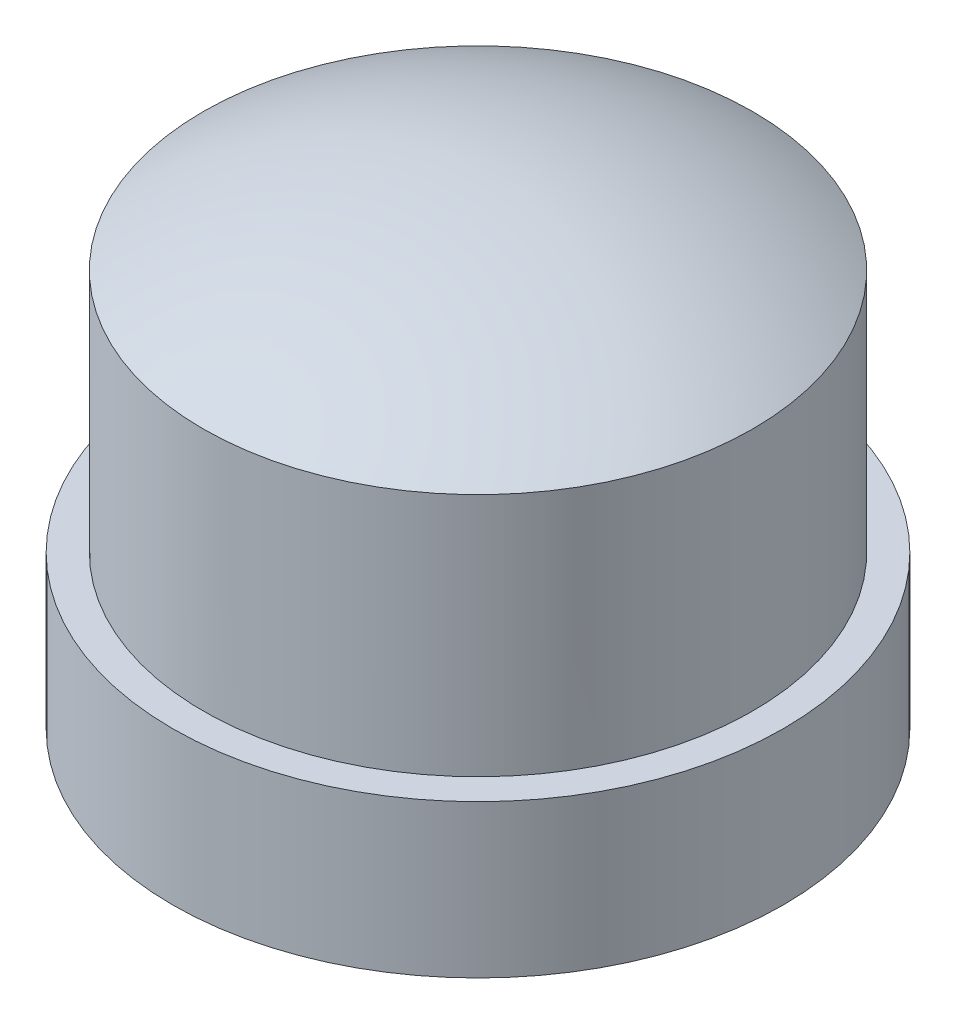
ISO-10303-21;
HEADER;
FILE_DESCRIPTION(('STEP AP214'),'2;1');
FILE_NAME('part.step','',(''),(''),'','','');
FILE_SCHEMA(('AUTOMOTIVE_DESIGN { 1 0 10303 214 1 1 1 1 }'));
ENDSEC;
DATA;
#1=APPLICATION_CONTEXT('core data for automotive mechanical design processes');
#2=APPLICATION_PROTOCOL_DEFINITION('international standard','automotive_design',2000,#1);
#3=PRODUCT_CONTEXT('',#1,'mechanical');
#4=PRODUCT('Part','Part','',(#3));
#5=PRODUCT_RELATED_PRODUCT_CATEGORY('part','',(#4));
#6=PRODUCT_DEFINITION_FORMATION('','',#4);
#7=PRODUCT_DEFINITION_CONTEXT('part definition',#1,'design');
#8=PRODUCT_DEFINITION('design','',#6,#7);
#9=PRODUCT_DEFINITION_SHAPE('','',#8);
#10=(LENGTH_UNIT() NAMED_UNIT(*) SI_UNIT(.MILLI.,.METRE.));
#11=(NAMED_UNIT(*) PLANE_ANGLE_UNIT() SI_UNIT($,.RADIAN.));
#12=(NAMED_UNIT(*) SI_UNIT($,.STERADIAN.) SOLID_ANGLE_UNIT());
#13=UNCERTAINTY_MEASURE_WITH_UNIT(LENGTH_MEASURE(1.E-05),#10,'distance_accuracy_value','');
#14=(GEOMETRIC_REPRESENTATION_CONTEXT(3) GLOBAL_UNCERTAINTY_ASSIGNED_CONTEXT((#13)) GLOBAL_UNIT_ASSIGNED_CONTEXT((#10,
#11,#12)) REPRESENTATION_CONTEXT('',''));
#15=CARTESIAN_POINT('',(0.,0.,0.));
#16=DIRECTION('',(0.,0.,1.));
#17=DIRECTION('',(1.,0.,0.));
#18=AXIS2_PLACEMENT_3D('',#15,#16,#17);
#19=CARTESIAN_POINT('',(0.,5.,0.));
#20=DIRECTION('',(0.,-1.,0.));
#21=DIRECTION('',(0.,0.,-1.));
#22=AXIS2_PLACEMENT_3D('',#19,#20,#21);
#23=CYLINDRICAL_SURFACE('',#22,10.);
#24=CARTESIAN_POINT('',(0.,5.,0.));
#25=DIRECTION('',(0.,1.,0.));
#26=DIRECTION('',(0.,0.,1.));
#27=AXIS2_PLACEMENT_3D('',#24,#25,#26);
#28=CIRCLE('',#27,10.);
#29=CARTESIAN_POINT('',(0.,5.,10.));
#30=VERTEX_POINT('',#29);
#31=EDGE_CURVE('E10',#30,#30,#28,.T.);
#32=ORIENTED_EDGE('',*,*,#31,.F.);
#33=EDGE_LOOP('',(#32));
#34=FACE_BOUND('',#33,.T.);
#35=CARTESIAN_POINT('',(0.,0.,0.));
#36=DIRECTION('',(0.,1.,0.));
#37=DIRECTION('',(0.,0.,1.));
#38=AXIS2_PLACEMENT_3D('',#35,#36,#37);
#39=CIRCLE('',#38,10.);
#40=CARTESIAN_POINT('',(0.,0.,10.));
#41=VERTEX_POINT('',#40);
#42=EDGE_CURVE('E34',#41,#41,#39,.T.);
#43=ORIENTED_EDGE('',*,*,#42,.T.);
#44=EDGE_LOOP('',(#43));
#45=FACE_BOUND('',#44,.T.);
#46=ADVANCED_FACE('F31',(#34,#45),#23,.T.);
#47=CARTESIAN_POINT('',(0.,5.,0.));
#48=DIRECTION('',(0.,1.,0.));
#49=DIRECTION('',(0.,0.,1.));
#50=AXIS2_PLACEMENT_3D('',#47,#48,#49);
#51=PLANE('',#50);
#52=CARTESIAN_POINT('',(0.,5.,0.));
#53=DIRECTION('',(0.,-1.,0.));
#54=DIRECTION('',(0.,0.,-1.));
#55=AXIS2_PLACEMENT_3D('',#52,#53,#54);
#56=CIRCLE('',#55,9.);
#57=CARTESIAN_POINT('',(0.,5.,-9.));
#58=VERTEX_POINT('',#57);
#59=EDGE_CURVE('E41',#58,#58,#56,.T.);
#60=ORIENTED_EDGE('',*,*,#59,.T.);
#61=EDGE_LOOP('',(#60));
#62=FACE_BOUND('',#61,.T.);
#63=ORIENTED_EDGE('',*,*,#31,.T.);
#64=EDGE_LOOP('',(#63));
#65=FACE_BOUND('',#64,.T.);
#66=ADVANCED_FACE('F61',(#62,#65),#51,.T.);
#67=CARTESIAN_POINT('',(0.,0.,0.));
#68=DIRECTION('',(0.,1.,0.));
#69=DIRECTION('',(0.,0.,1.));
#70=AXIS2_PLACEMENT_3D('',#67,#68,#69);
#71=PLANE('',#70);
#72=ORIENTED_EDGE('',*,*,#42,.F.);
#73=EDGE_LOOP('',(#72));
#74=FACE_BOUND('',#73,.T.);
#75=ADVANCED_FACE('F57',(#74),#71,.F.);
#76=CARTESIAN_POINT('',(0.,5.,0.));
#77=DIRECTION('',(0.,-1.,0.));
#78=DIRECTION('',(0.,0.,-1.));
#79=AXIS2_PLACEMENT_3D('',#76,#77,#78);
#80=CYLINDRICAL_SURFACE('',#79,9.);
#81=ORIENTED_EDGE('',*,*,#59,.F.);
#82=EDGE_LOOP('',(#81));
#83=FACE_BOUND('',#82,.T.);
#84=CARTESIAN_POINT('',(0.,13.,0.));
#85=DIRECTION('',(0.,-1.,0.));
#86=DIRECTION('',(0.,0.,-1.));
#87=AXIS2_PLACEMENT_3D('',#84,#85,#86);
#88=CIRCLE('',#87,9.);
#89=CARTESIAN_POINT('',(0.,13.,-9.));
#90=VERTEX_POINT('',#89);
#91=EDGE_CURVE('E45',#90,#90,#88,.T.);
#92=ORIENTED_EDGE('',*,*,#91,.T.);
#93=EDGE_LOOP('',(#92));
#94=FACE_BOUND('',#93,.T.);
#95=ADVANCED_FACE('F49',(#83,#94),#80,.T.);
#96=CARTESIAN_POINT('',(0.,-1.94999999999999,0.));
#97=DIRECTION('',(0.,-1.,0.));
#98=DIRECTION('',(0.,0.,1.));
#99=AXIS2_PLACEMENT_3D('',#96,#97,#98);
#100=SPHERICAL_SURFACE('',#99,17.45);
#101=ORIENTED_EDGE('',*,*,#91,.F.);
#102=EDGE_LOOP('',(#101));
#103=FACE_BOUND('',#102,.T.);
#104=ADVANCED_FACE('F51',(#103),#100,.T.);
#105=CLOSED_SHELL('',(#46,#66,#75,#95,#104));
#106=MANIFOLD_SOLID_BREP('B2',#105);
#107=ADVANCED_BREP_SHAPE_REPRESENTATION('',(#18,#106),#14);
#108=SHAPE_DEFINITION_REPRESENTATION(#9,#107);
ENDSEC;
END-ISO-10303-21;
